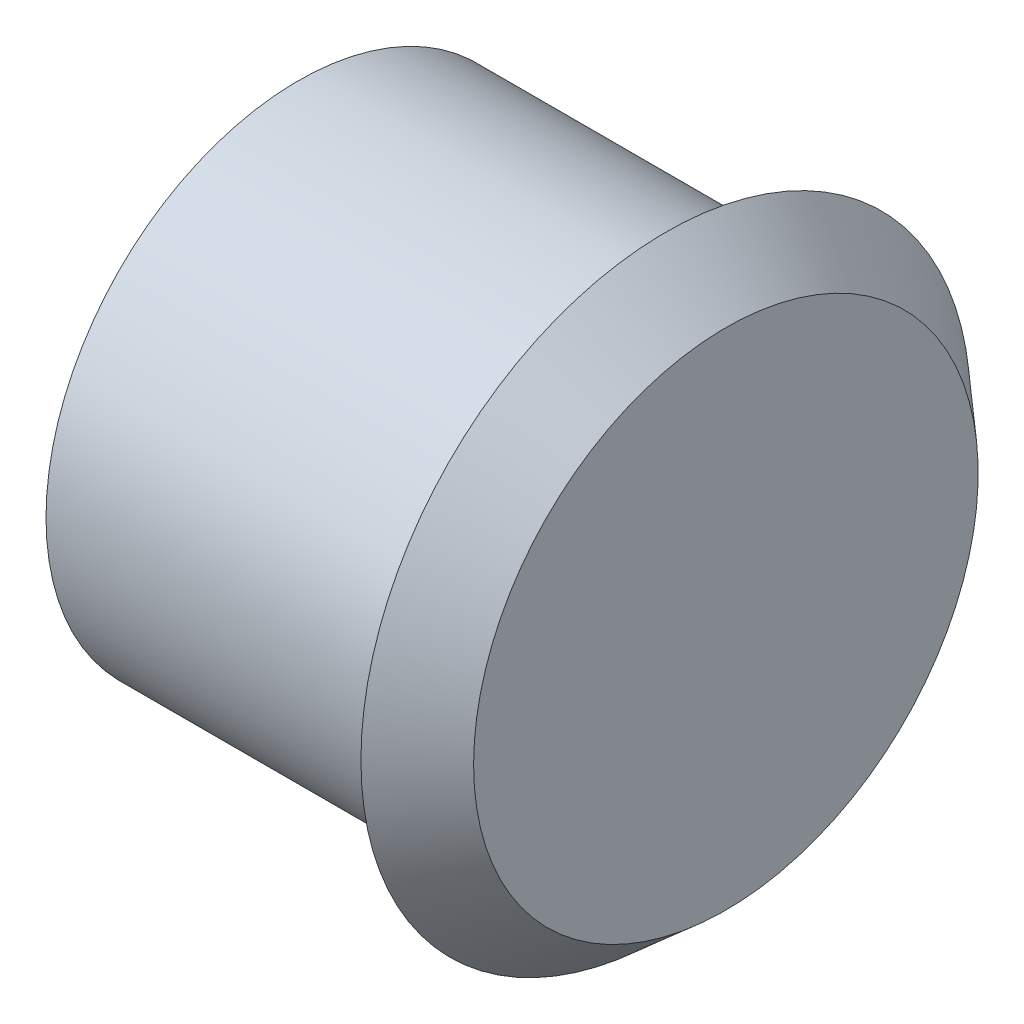
ISO-10303-21;
HEADER;
FILE_DESCRIPTION(('STEP AP214'),'2;1');
FILE_NAME('part.step','',(''),(''),'','','');
FILE_SCHEMA(('AUTOMOTIVE_DESIGN { 1 0 10303 214 1 1 1 1 }'));
ENDSEC;
DATA;
#1=APPLICATION_CONTEXT('core data for automotive mechanical design processes');
#2=APPLICATION_PROTOCOL_DEFINITION('international standard','automotive_design',2000,#1);
#3=PRODUCT_CONTEXT('',#1,'mechanical');
#4=PRODUCT('Part','Part','',(#3));
#5=PRODUCT_RELATED_PRODUCT_CATEGORY('part','',(#4));
#6=PRODUCT_DEFINITION_FORMATION('','',#4);
#7=PRODUCT_DEFINITION_CONTEXT('part definition',#1,'design');
#8=PRODUCT_DEFINITION('design','',#6,#7);
#9=PRODUCT_DEFINITION_SHAPE('','',#8);
#10=(LENGTH_UNIT() NAMED_UNIT(*) SI_UNIT(.MILLI.,.METRE.));
#11=(NAMED_UNIT(*) PLANE_ANGLE_UNIT() SI_UNIT($,.RADIAN.));
#12=(NAMED_UNIT(*) SI_UNIT($,.STERADIAN.) SOLID_ANGLE_UNIT());
#13=UNCERTAINTY_MEASURE_WITH_UNIT(LENGTH_MEASURE(1.E-05),#10,'distance_accuracy_value','');
#14=(GEOMETRIC_REPRESENTATION_CONTEXT(3) GLOBAL_UNCERTAINTY_ASSIGNED_CONTEXT((#13)) GLOBAL_UNIT_ASSIGNED_CONTEXT((#10,
#11,#12)) REPRESENTATION_CONTEXT('',''));
#15=CARTESIAN_POINT('',(0.,0.,0.));
#16=DIRECTION('',(0.,0.,1.));
#17=DIRECTION('',(1.,0.,0.));
#18=AXIS2_PLACEMENT_3D('',#15,#16,#17);
#19=CARTESIAN_POINT('',(136.272016,0.,159.011112));
#20=DIRECTION('',(-1.,0.,0.));
#21=DIRECTION('',(0.,0.,1.));
#22=AXIS2_PLACEMENT_3D('',#19,#20,#21);
#23=PLANE('',#22);
#24=CARTESIAN_POINT('',(136.272016,0.,142.853156));
#25=DIRECTION('',(-1.,0.,0.));
#26=DIRECTION('',(0.,0.,1.));
#27=AXIS2_PLACEMENT_3D('',#24,#25,#26);
#28=CIRCLE('',#27,16.157956);
#29=CARTESIAN_POINT('',(136.272016,0.,159.011112));
#30=VERTEX_POINT('',#29);
#31=EDGE_CURVE('E38',#30,#30,#28,.T.);
#32=ORIENTED_EDGE('',*,*,#31,.T.);
#33=EDGE_LOOP('',(#32));
#34=FACE_BOUND('',#33,.T.);
#35=CARTESIAN_POINT('',(136.272016,0.,142.853156));
#36=DIRECTION('',(-1.,0.,0.));
#37=DIRECTION('',(0.,0.,1.));
#38=AXIS2_PLACEMENT_3D('',#35,#36,#37);
#39=CIRCLE('',#38,13.371322);
#40=CARTESIAN_POINT('',(136.272016,0.,156.224478));
#41=VERTEX_POINT('',#40);
#42=EDGE_CURVE('E46',#41,#41,#39,.T.);
#43=ORIENTED_EDGE('',*,*,#42,.F.);
#44=EDGE_LOOP('',(#43));
#45=FACE_BOUND('',#44,.T.);
#46=ADVANCED_FACE('F31',(#34,#45),#23,.T.);
#47=CARTESIAN_POINT('',(139.45743,0.,142.853156));
#48=DIRECTION('',(1.,0.,0.));
#49=DIRECTION('',(0.,0.,-1.));
#50=AXIS2_PLACEMENT_3D('',#47,#48,#49);
#51=PLANE('',#50);
#52=CARTESIAN_POINT('',(139.45743,0.,142.853156));
#53=DIRECTION('',(-1.,0.,0.));
#54=DIRECTION('',(0.,0.,1.));
#55=AXIS2_PLACEMENT_3D('',#52,#53,#54);
#56=CIRCLE('',#55,13.371322);
#57=CARTESIAN_POINT('',(139.45743,0.,156.224478));
#58=VERTEX_POINT('',#57);
#59=EDGE_CURVE('E10',#58,#58,#56,.T.);
#60=ORIENTED_EDGE('',*,*,#59,.F.);
#61=EDGE_LOOP('',(#60));
#62=FACE_BOUND('',#61,.T.);
#63=ADVANCED_FACE('F33',(#62),#51,.T.);
#64=CARTESIAN_POINT('',(136.272016,0.,142.853156));
#65=DIRECTION('',(-1.,0.,0.));
#66=DIRECTION('',(0.,0.,1.));
#67=AXIS2_PLACEMENT_3D('',#64,#65,#66);
#68=CONICAL_SURFACE('',#67,16.157956,0.718722730744122);
#69=ORIENTED_EDGE('',*,*,#59,.T.);
#70=EDGE_LOOP('',(#69));
#71=FACE_BOUND('',#70,.T.);
#72=ORIENTED_EDGE('',*,*,#31,.F.);
#73=EDGE_LOOP('',(#72));
#74=FACE_BOUND('',#73,.T.);
#75=ADVANCED_FACE('F59',(#71,#74),#68,.T.);
#76=CARTESIAN_POINT('',(116.794788,0.,142.853156));
#77=DIRECTION('',(1.,0.,0.));
#78=DIRECTION('',(0.,0.,-1.));
#79=AXIS2_PLACEMENT_3D('',#76,#77,#78);
#80=CYLINDRICAL_SURFACE('',#79,13.371322);
#81=CARTESIAN_POINT('',(116.794788,0.,142.853156));
#82=DIRECTION('',(-1.,0.,0.));
#83=DIRECTION('',(0.,0.,1.));
#84=AXIS2_PLACEMENT_3D('',#81,#82,#83);
#85=CIRCLE('',#84,13.371322);
#86=CARTESIAN_POINT('',(116.794788,0.,156.224478));
#87=VERTEX_POINT('',#86);
#88=EDGE_CURVE('E42',#87,#87,#85,.T.);
#89=ORIENTED_EDGE('',*,*,#88,.F.);
#90=EDGE_LOOP('',(#89));
#91=FACE_BOUND('',#90,.T.);
#92=ORIENTED_EDGE('',*,*,#42,.T.);
#93=EDGE_LOOP('',(#92));
#94=FACE_BOUND('',#93,.T.);
#95=ADVANCED_FACE('F52',(#91,#94),#80,.T.);
#96=CARTESIAN_POINT('',(116.794788,0.,142.853156));
#97=DIRECTION('',(-1.,0.,0.));
#98=DIRECTION('',(0.,0.,1.));
#99=AXIS2_PLACEMENT_3D('',#96,#97,#98);
#100=PLANE('',#99);
#101=ORIENTED_EDGE('',*,*,#88,.T.);
#102=EDGE_LOOP('',(#101));
#103=FACE_BOUND('',#102,.T.);
#104=ADVANCED_FACE('F67',(#103),#100,.T.);
#105=CLOSED_SHELL('',(#46,#63,#75,#95,#104));
#106=MANIFOLD_SOLID_BREP('B2',#105);
#107=ADVANCED_BREP_SHAPE_REPRESENTATION('',(#18,#106),#14);
#108=SHAPE_DEFINITION_REPRESENTATION(#9,#107);
ENDSEC;
END-ISO-10303-21;
